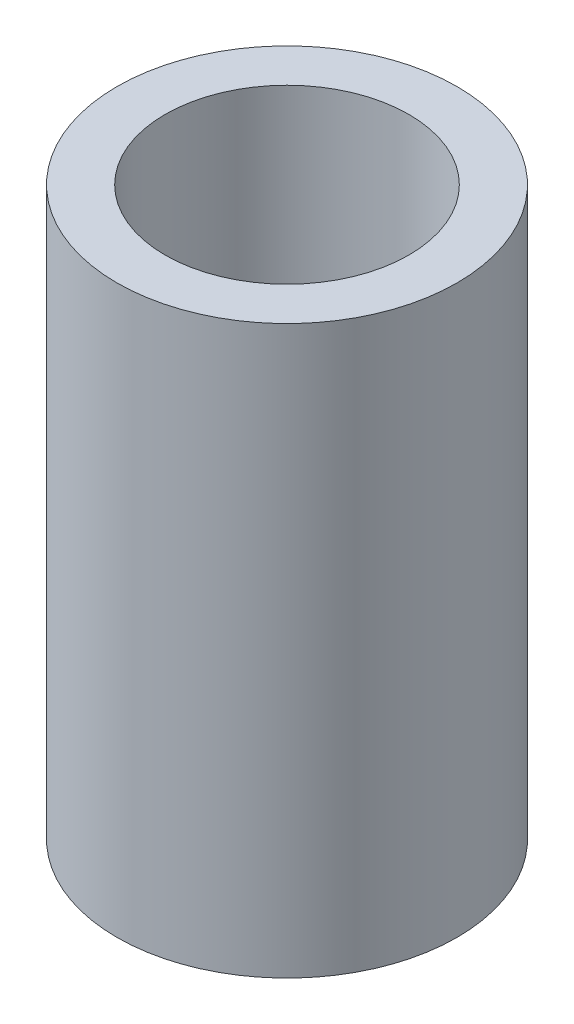
ISO-10303-21;
HEADER;
FILE_DESCRIPTION(('STEP AP214'),'2;1');
FILE_NAME('part.step','',(''),(''),'','','');
FILE_SCHEMA(('AUTOMOTIVE_DESIGN { 1 0 10303 214 1 1 1 1 }'));
ENDSEC;
DATA;
#1=APPLICATION_CONTEXT('core data for automotive mechanical design processes');
#2=APPLICATION_PROTOCOL_DEFINITION('international standard','automotive_design',2000,#1);
#3=PRODUCT_CONTEXT('',#1,'mechanical');
#4=PRODUCT('Part','Part','',(#3));
#5=PRODUCT_RELATED_PRODUCT_CATEGORY('part','',(#4));
#6=PRODUCT_DEFINITION_FORMATION('','',#4);
#7=PRODUCT_DEFINITION_CONTEXT('part definition',#1,'design');
#8=PRODUCT_DEFINITION('design','',#6,#7);
#9=PRODUCT_DEFINITION_SHAPE('','',#8);
#10=(LENGTH_UNIT() NAMED_UNIT(*) SI_UNIT(.MILLI.,.METRE.));
#11=(NAMED_UNIT(*) PLANE_ANGLE_UNIT() SI_UNIT($,.RADIAN.));
#12=(NAMED_UNIT(*) SI_UNIT($,.STERADIAN.) SOLID_ANGLE_UNIT());
#13=UNCERTAINTY_MEASURE_WITH_UNIT(LENGTH_MEASURE(1.E-05),#10,'distance_accuracy_value','');
#14=(GEOMETRIC_REPRESENTATION_CONTEXT(3) GLOBAL_UNCERTAINTY_ASSIGNED_CONTEXT((#13)) GLOBAL_UNIT_ASSIGNED_CONTEXT((#10,
#11,#12)) REPRESENTATION_CONTEXT('',''));
#15=CARTESIAN_POINT('',(0.,0.,0.));
#16=DIRECTION('',(0.,0.,1.));
#17=DIRECTION('',(1.,0.,0.));
#18=AXIS2_PLACEMENT_3D('',#15,#16,#17);
#19=CARTESIAN_POINT('',(0.,20.,0.));
#20=DIRECTION('',(0.,1.,0.));
#21=DIRECTION('',(0.,0.,1.));
#22=AXIS2_PLACEMENT_3D('',#19,#20,#21);
#23=PLANE('',#22);
#24=CARTESIAN_POINT('',(0.,20.,0.));
#25=DIRECTION('',(0.,1.,0.));
#26=DIRECTION('',(0.,0.,1.));
#27=AXIS2_PLACEMENT_3D('',#24,#25,#26);
#28=CIRCLE('',#27,6.);
#29=CARTESIAN_POINT('',(0.,20.,6.));
#30=VERTEX_POINT('',#29);
#31=EDGE_CURVE('E10',#30,#30,#28,.T.);
#32=ORIENTED_EDGE('',*,*,#31,.T.);
#33=EDGE_LOOP('',(#32));
#34=FACE_BOUND('',#33,.T.);
#35=CARTESIAN_POINT('',(0.,20.,0.));
#36=DIRECTION('',(0.,1.,0.));
#37=DIRECTION('',(0.,0.,1.));
#38=AXIS2_PLACEMENT_3D('',#35,#36,#37);
#39=CIRCLE('',#38,4.3);
#40=CARTESIAN_POINT('',(0.,20.,4.3));
#41=VERTEX_POINT('',#40);
#42=EDGE_CURVE('E44',#41,#41,#39,.T.);
#43=ORIENTED_EDGE('',*,*,#42,.F.);
#44=EDGE_LOOP('',(#43));
#45=FACE_BOUND('',#44,.T.);
#46=ADVANCED_FACE('F33',(#34,#45),#23,.T.);
#47=CARTESIAN_POINT('',(0.,0.,0.));
#48=DIRECTION('',(0.,1.,0.));
#49=DIRECTION('',(0.,0.,1.));
#50=AXIS2_PLACEMENT_3D('',#47,#48,#49);
#51=PLANE('',#50);
#52=CARTESIAN_POINT('',(0.,0.,0.));
#53=DIRECTION('',(0.,1.,0.));
#54=DIRECTION('',(0.,0.,1.));
#55=AXIS2_PLACEMENT_3D('',#52,#53,#54);
#56=CIRCLE('',#55,6.);
#57=CARTESIAN_POINT('',(0.,0.,6.));
#58=VERTEX_POINT('',#57);
#59=EDGE_CURVE('E37',#58,#58,#56,.T.);
#60=ORIENTED_EDGE('',*,*,#59,.F.);
#61=EDGE_LOOP('',(#60));
#62=FACE_BOUND('',#61,.T.);
#63=CARTESIAN_POINT('',(0.,0.,0.));
#64=DIRECTION('',(0.,1.,0.));
#65=DIRECTION('',(0.,0.,1.));
#66=AXIS2_PLACEMENT_3D('',#63,#64,#65);
#67=CIRCLE('',#66,4.3);
#68=CARTESIAN_POINT('',(0.,0.,4.3));
#69=VERTEX_POINT('',#68);
#70=EDGE_CURVE('E46',#69,#69,#67,.T.);
#71=ORIENTED_EDGE('',*,*,#70,.T.);
#72=EDGE_LOOP('',(#71));
#73=FACE_BOUND('',#72,.T.);
#74=ADVANCED_FACE('F56',(#62,#73),#51,.F.);
#75=CARTESIAN_POINT('',(0.,20.,0.));
#76=DIRECTION('',(0.,-1.,0.));
#77=DIRECTION('',(0.,0.,-1.));
#78=AXIS2_PLACEMENT_3D('',#75,#76,#77);
#79=CYLINDRICAL_SURFACE('',#78,6.);
#80=ORIENTED_EDGE('',*,*,#31,.F.);
#81=EDGE_LOOP('',(#80));
#82=FACE_BOUND('',#81,.T.);
#83=ORIENTED_EDGE('',*,*,#59,.T.);
#84=EDGE_LOOP('',(#83));
#85=FACE_BOUND('',#84,.T.);
#86=ADVANCED_FACE('F35',(#82,#85),#79,.T.);
#87=CARTESIAN_POINT('',(0.,20.,0.));
#88=DIRECTION('',(0.,-1.,0.));
#89=DIRECTION('',(0.,0.,-1.));
#90=AXIS2_PLACEMENT_3D('',#87,#88,#89);
#91=CYLINDRICAL_SURFACE('',#90,4.3);
#92=ORIENTED_EDGE('',*,*,#42,.T.);
#93=EDGE_LOOP('',(#92));
#94=FACE_BOUND('',#93,.T.);
#95=ORIENTED_EDGE('',*,*,#70,.F.);
#96=EDGE_LOOP('',(#95));
#97=FACE_BOUND('',#96,.T.);
#98=ADVANCED_FACE('F52',(#94,#97),#91,.F.);
#99=CLOSED_SHELL('',(#46,#74,#86,#98));
#100=MANIFOLD_SOLID_BREP('B2',#99);
#101=ADVANCED_BREP_SHAPE_REPRESENTATION('',(#18,#100),#14);
#102=SHAPE_DEFINITION_REPRESENTATION(#9,#101);
ENDSEC;
END-ISO-10303-21;
